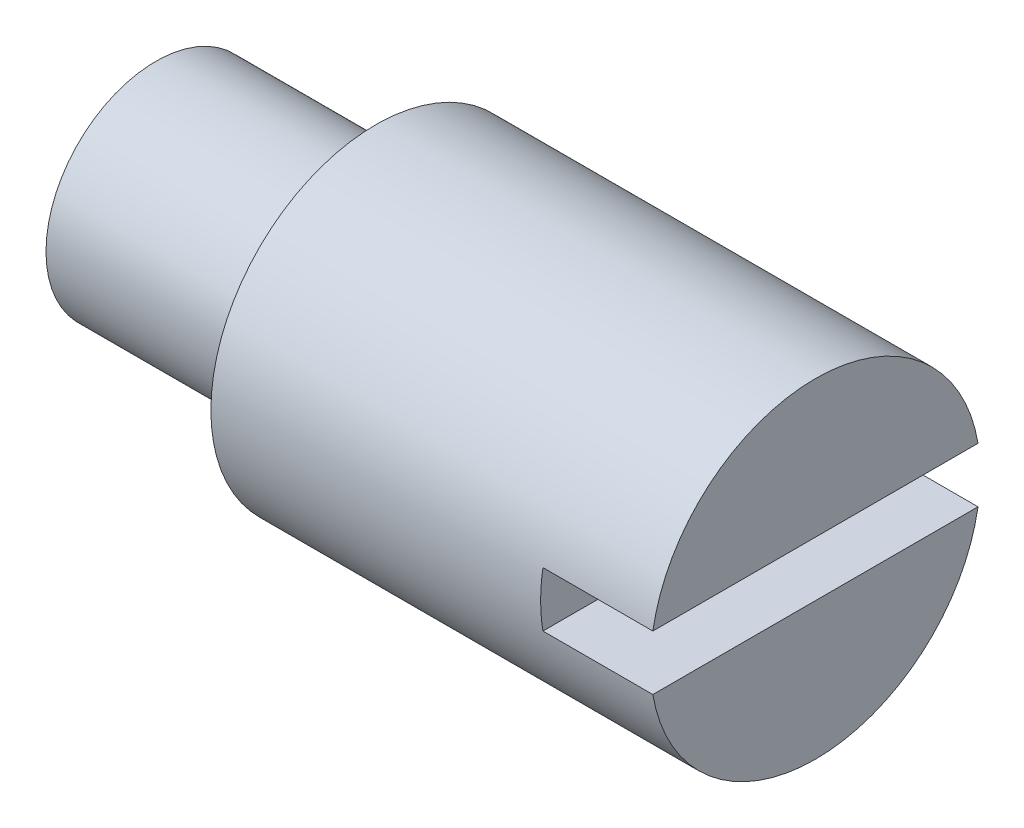
ISO-10303-21;
HEADER;
FILE_DESCRIPTION(('STEP AP214'),'2;1');
FILE_NAME('part.step','',(''),(''),'','','');
FILE_SCHEMA(('AUTOMOTIVE_DESIGN { 1 0 10303 214 1 1 1 1 }'));
ENDSEC;
DATA;
#1=APPLICATION_CONTEXT('core data for automotive mechanical design processes');
#2=APPLICATION_PROTOCOL_DEFINITION('international standard','automotive_design',2000,#1);
#3=PRODUCT_CONTEXT('',#1,'mechanical');
#4=PRODUCT('Part','Part','',(#3));
#5=PRODUCT_RELATED_PRODUCT_CATEGORY('part','',(#4));
#6=PRODUCT_DEFINITION_FORMATION('','',#4);
#7=PRODUCT_DEFINITION_CONTEXT('part definition',#1,'design');
#8=PRODUCT_DEFINITION('design','',#6,#7);
#9=PRODUCT_DEFINITION_SHAPE('','',#8);
#10=(LENGTH_UNIT() NAMED_UNIT(*) SI_UNIT(.MILLI.,.METRE.));
#11=(NAMED_UNIT(*) PLANE_ANGLE_UNIT() SI_UNIT($,.RADIAN.));
#12=(NAMED_UNIT(*) SI_UNIT($,.STERADIAN.) SOLID_ANGLE_UNIT());
#13=UNCERTAINTY_MEASURE_WITH_UNIT(LENGTH_MEASURE(1.E-05),#10,'distance_accuracy_value','');
#14=(GEOMETRIC_REPRESENTATION_CONTEXT(3) GLOBAL_UNCERTAINTY_ASSIGNED_CONTEXT((#13)) GLOBAL_UNIT_ASSIGNED_CONTEXT((#10,
#11,#12)) REPRESENTATION_CONTEXT('',''));
#15=CARTESIAN_POINT('',(0.,0.,0.));
#16=DIRECTION('',(0.,0.,1.));
#17=DIRECTION('',(1.,0.,0.));
#18=AXIS2_PLACEMENT_3D('',#15,#16,#17);
#19=CARTESIAN_POINT('',(12.,3.,0.));
#20=DIRECTION('',(-1.,0.,0.));
#21=DIRECTION('',(0.,0.,1.));
#22=AXIS2_PLACEMENT_3D('',#19,#20,#21);
#23=PLANE('',#22);
#24=CARTESIAN_POINT('',(12.,0.,0.));
#25=DIRECTION('',(-1.,0.,0.));
#26=DIRECTION('',(0.,0.,1.));
#27=AXIS2_PLACEMENT_3D('',#24,#25,#26);
#28=CIRCLE('',#27,3.);
#29=CARTESIAN_POINT('',(12.,-0.5,-2.95803989154981));
#30=VERTEX_POINT('',#29);
#31=CARTESIAN_POINT('',(12.,-0.5,2.95803989154981));
#32=VERTEX_POINT('',#31);
#33=EDGE_CURVE('E94',#30,#32,#28,.T.);
#34=ORIENTED_EDGE('',*,*,#33,.F.);
#35=DIRECTION('',(0.,0.,1.));
#36=VECTOR('',#35,1.);
#37=CARTESIAN_POINT('',(12.,-0.5,0.));
#38=LINE('',#37,#36);
#39=EDGE_CURVE('E107',#30,#32,#38,.T.);
#40=ORIENTED_EDGE('',*,*,#39,.T.);
#41=EDGE_LOOP('',(#34,#40));
#42=FACE_BOUND('',#41,.T.);
#43=ADVANCED_FACE('F33',(#42),#23,.F.);
#44=CARTESIAN_POINT('',(0.,0.,0.));
#45=DIRECTION('',(1.,0.,0.));
#46=DIRECTION('',(0.,0.,-1.));
#47=AXIS2_PLACEMENT_3D('',#44,#45,#46);
#48=PLANE('',#47);
#49=CARTESIAN_POINT('',(0.,0.,0.));
#50=DIRECTION('',(-1.,0.,0.));
#51=DIRECTION('',(0.,0.,1.));
#52=AXIS2_PLACEMENT_3D('',#49,#50,#51);
#53=CIRCLE('',#52,2.);
#54=CARTESIAN_POINT('',(0.,0.,2.));
#55=VERTEX_POINT('',#54);
#56=EDGE_CURVE('E103',#55,#55,#53,.T.);
#57=ORIENTED_EDGE('',*,*,#56,.T.);
#58=EDGE_LOOP('',(#57));
#59=FACE_BOUND('',#58,.T.);
#60=ADVANCED_FACE('F35',(#59),#48,.F.);
#61=CARTESIAN_POINT('',(-2.88091510560064,0.,0.));
#62=DIRECTION('',(-1.,0.,0.));
#63=DIRECTION('',(0.,0.,1.));
#64=AXIS2_PLACEMENT_3D('',#61,#62,#63);
#65=CYLINDRICAL_SURFACE('',#64,2.);
#66=ORIENTED_EDGE('',*,*,#56,.F.);
#67=EDGE_LOOP('',(#66));
#68=FACE_BOUND('',#67,.T.);
#69=CARTESIAN_POINT('',(4.,0.,0.));
#70=DIRECTION('',(-1.,0.,0.));
#71=DIRECTION('',(0.,0.,1.));
#72=AXIS2_PLACEMENT_3D('',#69,#70,#71);
#73=CIRCLE('',#72,2.);
#74=CARTESIAN_POINT('',(4.,0.,2.));
#75=VERTEX_POINT('',#74);
#76=EDGE_CURVE('E100',#75,#75,#73,.T.);
#77=ORIENTED_EDGE('',*,*,#76,.T.);
#78=EDGE_LOOP('',(#77));
#79=FACE_BOUND('',#78,.T.);
#80=ADVANCED_FACE('F120',(#68,#79),#65,.T.);
#81=CARTESIAN_POINT('',(4.,2.,0.));
#82=DIRECTION('',(1.,0.,0.));
#83=DIRECTION('',(0.,0.,-1.));
#84=AXIS2_PLACEMENT_3D('',#81,#82,#83);
#85=PLANE('',#84);
#86=ORIENTED_EDGE('',*,*,#76,.F.);
#87=EDGE_LOOP('',(#86));
#88=FACE_BOUND('',#87,.T.);
#89=CARTESIAN_POINT('',(4.,0.,0.));
#90=DIRECTION('',(-1.,0.,0.));
#91=DIRECTION('',(0.,0.,1.));
#92=AXIS2_PLACEMENT_3D('',#89,#90,#91);
#93=CIRCLE('',#92,3.);
#94=CARTESIAN_POINT('',(4.,0.,3.));
#95=VERTEX_POINT('',#94);
#96=EDGE_CURVE('E97',#95,#95,#93,.T.);
#97=ORIENTED_EDGE('',*,*,#96,.T.);
#98=EDGE_LOOP('',(#97));
#99=FACE_BOUND('',#98,.T.);
#100=ADVANCED_FACE('F131',(#88,#99),#85,.F.);
#101=CARTESIAN_POINT('',(-2.88091510560064,0.,0.));
#102=DIRECTION('',(-1.,0.,0.));
#103=DIRECTION('',(0.,0.,1.));
#104=AXIS2_PLACEMENT_3D('',#101,#102,#103);
#105=CYLINDRICAL_SURFACE('',#104,3.);
#106=ORIENTED_EDGE('',*,*,#96,.F.);
#107=EDGE_LOOP('',(#106));
#108=FACE_BOUND('',#107,.T.);
#109=DIRECTION('',(-1.,0.,0.));
#110=VECTOR('',#109,1.);
#111=CARTESIAN_POINT('',(-2.88091510560064,0.5,-2.95803989154981));
#112=LINE('',#111,#110);
#113=CARTESIAN_POINT('',(12.,0.5,-2.95803989154981));
#114=VERTEX_POINT('',#113);
#115=CARTESIAN_POINT('',(10.,0.5,-2.95803989154981));
#116=VERTEX_POINT('',#115);
#117=EDGE_CURVE('E48',#114,#116,#112,.T.);
#118=ORIENTED_EDGE('',*,*,#117,.T.);
#119=CARTESIAN_POINT('',(10.,0.,0.));
#120=DIRECTION('',(-1.,0.,0.));
#121=DIRECTION('',(0.,0.,1.));
#122=AXIS2_PLACEMENT_3D('',#119,#120,#121);
#123=CIRCLE('',#122,3.);
#124=CARTESIAN_POINT('',(10.,-0.5,-2.95803989154981));
#125=VERTEX_POINT('',#124);
#126=EDGE_CURVE('E11',#116,#125,#123,.T.);
#127=ORIENTED_EDGE('',*,*,#126,.T.);
#128=DIRECTION('',(-1.,0.,0.));
#129=VECTOR('',#128,1.);
#130=CARTESIAN_POINT('',(-2.88091510560064,-0.5,-2.95803989154981));
#131=LINE('',#130,#129);
#132=EDGE_CURVE('E86',#125,#30,#131,.F.);
#133=ORIENTED_EDGE('',*,*,#132,.T.);
#134=ORIENTED_EDGE('',*,*,#33,.T.);
#135=DIRECTION('',(-1.,0.,0.));
#136=VECTOR('',#135,1.);
#137=CARTESIAN_POINT('',(-2.88091510560064,-0.5,2.95803989154981));
#138=LINE('',#137,#136);
#139=CARTESIAN_POINT('',(10.,-0.5,2.95803989154981));
#140=VERTEX_POINT('',#139);
#141=EDGE_CURVE('E88',#32,#140,#138,.T.);
#142=ORIENTED_EDGE('',*,*,#141,.T.);
#143=CARTESIAN_POINT('',(10.,0.5,2.95803989154981));
#144=VERTEX_POINT('',#143);
#145=EDGE_CURVE('E37',#140,#144,#123,.T.);
#146=ORIENTED_EDGE('',*,*,#145,.T.);
#147=DIRECTION('',(-1.,0.,0.));
#148=VECTOR('',#147,1.);
#149=CARTESIAN_POINT('',(-2.88091510560064,0.5,2.95803989154981));
#150=LINE('',#149,#148);
#151=CARTESIAN_POINT('',(12.,0.5,2.95803989154981));
#152=VERTEX_POINT('',#151);
#153=EDGE_CURVE('E80',#144,#152,#150,.F.);
#154=ORIENTED_EDGE('',*,*,#153,.T.);
#155=EDGE_CURVE('E85',#152,#114,#28,.T.);
#156=ORIENTED_EDGE('',*,*,#155,.T.);
#157=EDGE_LOOP('',(#118,#127,#133,#134,#142,#146,#154,#156));
#158=FACE_BOUND('',#157,.T.);
#159=ADVANCED_FACE('F83',(#108,#158),#105,.T.);
#160=ORIENTED_EDGE('',*,*,#155,.F.);
#161=DIRECTION('',(0.,0.,-1.));
#162=VECTOR('',#161,1.);
#163=CARTESIAN_POINT('',(12.,0.5,0.));
#164=LINE('',#163,#162);
#165=EDGE_CURVE('E106',#152,#114,#164,.T.);
#166=ORIENTED_EDGE('',*,*,#165,.T.);
#167=EDGE_LOOP('',(#160,#166));
#168=FACE_BOUND('',#167,.T.);
#169=ADVANCED_FACE('F116',(#168),#23,.F.);
#170=CARTESIAN_POINT('',(10.,-0.5,-3.));
#171=DIRECTION('',(-1.,0.,0.));
#172=DIRECTION('',(0.,0.,1.));
#173=AXIS2_PLACEMENT_3D('',#170,#171,#172);
#174=PLANE('',#173);
#175=DIRECTION('',(0.,0.,1.));
#176=VECTOR('',#175,1.);
#177=CARTESIAN_POINT('',(10.,0.5,-3.));
#178=LINE('',#177,#176);
#179=EDGE_CURVE('E73',#116,#144,#178,.T.);
#180=ORIENTED_EDGE('',*,*,#179,.T.);
#181=ORIENTED_EDGE('',*,*,#145,.F.);
#182=DIRECTION('',(0.,0.,1.));
#183=VECTOR('',#182,1.);
#184=CARTESIAN_POINT('',(10.,-0.5,-3.));
#185=LINE('',#184,#183);
#186=EDGE_CURVE('E74',#125,#140,#185,.T.);
#187=ORIENTED_EDGE('',*,*,#186,.F.);
#188=ORIENTED_EDGE('',*,*,#126,.F.);
#189=EDGE_LOOP('',(#180,#181,#187,#188));
#190=FACE_BOUND('',#189,.T.);
#191=ADVANCED_FACE('F72',(#190),#174,.F.);
#192=CARTESIAN_POINT('',(10.,-0.5,-3.));
#193=DIRECTION('',(0.,-1.,0.));
#194=DIRECTION('',(0.,0.,-1.));
#195=AXIS2_PLACEMENT_3D('',#192,#193,#194);
#196=PLANE('',#195);
#197=ORIENTED_EDGE('',*,*,#39,.F.);
#198=ORIENTED_EDGE('',*,*,#132,.F.);
#199=ORIENTED_EDGE('',*,*,#186,.T.);
#200=ORIENTED_EDGE('',*,*,#141,.F.);
#201=EDGE_LOOP('',(#197,#198,#199,#200));
#202=FACE_BOUND('',#201,.T.);
#203=ADVANCED_FACE('F112',(#202),#196,.F.);
#204=CARTESIAN_POINT('',(10.,0.5,-3.));
#205=DIRECTION('',(0.,1.,0.));
#206=DIRECTION('',(0.,0.,1.));
#207=AXIS2_PLACEMENT_3D('',#204,#205,#206);
#208=PLANE('',#207);
#209=ORIENTED_EDGE('',*,*,#165,.F.);
#210=ORIENTED_EDGE('',*,*,#153,.F.);
#211=ORIENTED_EDGE('',*,*,#179,.F.);
#212=ORIENTED_EDGE('',*,*,#117,.F.);
#213=EDGE_LOOP('',(#209,#210,#211,#212));
#214=FACE_BOUND('',#213,.T.);
#215=ADVANCED_FACE('F78',(#214),#208,.F.);
#216=CLOSED_SHELL('',(#43,#60,#80,#100,#159,#169,#191,#203,#215));
#217=MANIFOLD_SOLID_BREP('B2',#216);
#218=ADVANCED_BREP_SHAPE_REPRESENTATION('',(#18,#217),#14);
#219=SHAPE_DEFINITION_REPRESENTATION(#9,#218);
ENDSEC;
END-ISO-10303-21;
